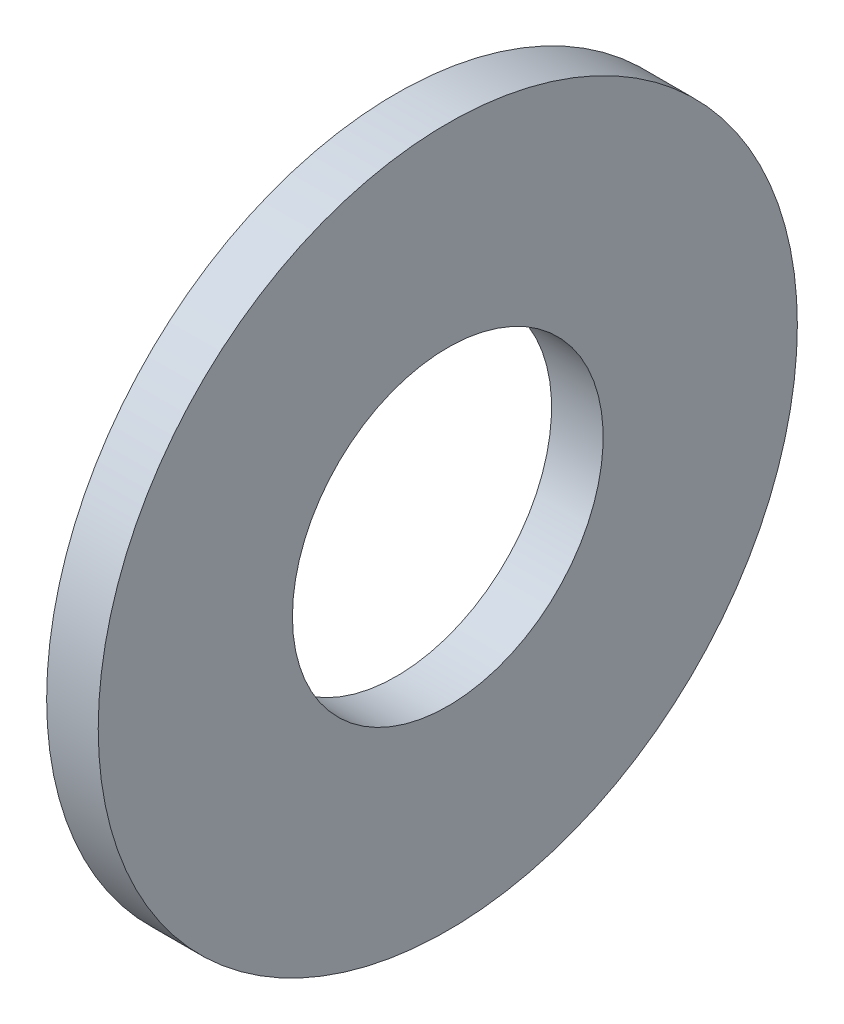
ISO-10303-21;
HEADER;
FILE_DESCRIPTION(('STEP AP214'),'2;1');
FILE_NAME('part.step','',(''),(''),'','','');
FILE_SCHEMA(('AUTOMOTIVE_DESIGN { 1 0 10303 214 1 1 1 1 }'));
ENDSEC;
DATA;
#1=APPLICATION_CONTEXT('core data for automotive mechanical design processes');
#2=APPLICATION_PROTOCOL_DEFINITION('international standard','automotive_design',2000,#1);
#3=PRODUCT_CONTEXT('',#1,'mechanical');
#4=PRODUCT('Part','Part','',(#3));
#5=PRODUCT_RELATED_PRODUCT_CATEGORY('part','',(#4));
#6=PRODUCT_DEFINITION_FORMATION('','',#4);
#7=PRODUCT_DEFINITION_CONTEXT('part definition',#1,'design');
#8=PRODUCT_DEFINITION('design','',#6,#7);
#9=PRODUCT_DEFINITION_SHAPE('','',#8);
#10=(LENGTH_UNIT() NAMED_UNIT(*) SI_UNIT(.MILLI.,.METRE.));
#11=(NAMED_UNIT(*) PLANE_ANGLE_UNIT() SI_UNIT($,.RADIAN.));
#12=(NAMED_UNIT(*) SI_UNIT($,.STERADIAN.) SOLID_ANGLE_UNIT());
#13=UNCERTAINTY_MEASURE_WITH_UNIT(LENGTH_MEASURE(1.E-05),#10,'distance_accuracy_value','');
#14=(GEOMETRIC_REPRESENTATION_CONTEXT(3) GLOBAL_UNCERTAINTY_ASSIGNED_CONTEXT((#13)) GLOBAL_UNIT_ASSIGNED_CONTEXT((#10,
#11,#12)) REPRESENTATION_CONTEXT('',''));
#15=CARTESIAN_POINT('',(0.,0.,0.));
#16=DIRECTION('',(0.,0.,1.));
#17=DIRECTION('',(1.,0.,0.));
#18=AXIS2_PLACEMENT_3D('',#15,#16,#17);
#19=CARTESIAN_POINT('',(-34.9249999999999,0.,0.));
#20=DIRECTION('',(-1.,0.,0.));
#21=DIRECTION('',(0.,0.,0.999999999999998));
#22=AXIS2_PLACEMENT_3D('',#19,#20,#21);
#23=CYLINDRICAL_SURFACE('',#22,6.35);
#24=CARTESIAN_POINT('',(0.,0.,0.));
#25=DIRECTION('',(-1.,0.,0.));
#26=DIRECTION('',(0.,0.,0.999999999999998));
#27=AXIS2_PLACEMENT_3D('',#24,#25,#26);
#28=CIRCLE('',#27,6.35);
#29=CARTESIAN_POINT('',(0.,0.,6.34999999999999));
#30=VERTEX_POINT('',#29);
#31=EDGE_CURVE('E10',#30,#30,#28,.T.);
#32=ORIENTED_EDGE('',*,*,#31,.F.);
#33=EDGE_LOOP('',(#32));
#34=FACE_BOUND('',#33,.T.);
#35=CARTESIAN_POINT('',(-2.10819999999999,0.,0.));
#36=DIRECTION('',(-1.,0.,0.));
#37=DIRECTION('',(0.,0.,0.999999999999998));
#38=AXIS2_PLACEMENT_3D('',#35,#36,#37);
#39=CIRCLE('',#38,6.35);
#40=CARTESIAN_POINT('',(-2.10819999999999,0.,6.34999999999999));
#41=VERTEX_POINT('',#40);
#42=EDGE_CURVE('E44',#41,#41,#39,.T.);
#43=ORIENTED_EDGE('',*,*,#42,.T.);
#44=EDGE_LOOP('',(#43));
#45=FACE_BOUND('',#44,.T.);
#46=ADVANCED_FACE('F30',(#34,#45),#23,.F.);
#47=CARTESIAN_POINT('',(0.,6.34999999999994,0.));
#48=DIRECTION('',(-1.,0.,0.));
#49=DIRECTION('',(0.,0.,0.999999999999998));
#50=AXIS2_PLACEMENT_3D('',#47,#48,#49);
#51=PLANE('',#50);
#52=CARTESIAN_POINT('',(0.,0.,0.));
#53=DIRECTION('',(-1.,0.,0.));
#54=DIRECTION('',(0.,0.,0.999999999999998));
#55=AXIS2_PLACEMENT_3D('',#52,#53,#54);
#56=CIRCLE('',#55,14.2875);
#57=CARTESIAN_POINT('',(0.,0.,14.2875));
#58=VERTEX_POINT('',#57);
#59=EDGE_CURVE('E36',#58,#58,#56,.T.);
#60=ORIENTED_EDGE('',*,*,#59,.F.);
#61=EDGE_LOOP('',(#60));
#62=FACE_BOUND('',#61,.T.);
#63=ORIENTED_EDGE('',*,*,#31,.T.);
#64=EDGE_LOOP('',(#63));
#65=FACE_BOUND('',#64,.T.);
#66=ADVANCED_FACE('F59',(#62,#65),#51,.F.);
#67=CARTESIAN_POINT('',(-34.9249999999999,0.,0.));
#68=DIRECTION('',(-1.,0.,0.));
#69=DIRECTION('',(0.,0.,0.999999999999998));
#70=AXIS2_PLACEMENT_3D('',#67,#68,#69);
#71=CYLINDRICAL_SURFACE('',#70,14.2875);
#72=CARTESIAN_POINT('',(-2.10819999999999,0.,0.));
#73=DIRECTION('',(-1.,0.,0.));
#74=DIRECTION('',(0.,0.,0.999999999999998));
#75=AXIS2_PLACEMENT_3D('',#72,#73,#74);
#76=CIRCLE('',#75,14.2875);
#77=CARTESIAN_POINT('',(-2.10819999999999,0.,14.2875));
#78=VERTEX_POINT('',#77);
#79=EDGE_CURVE('E40',#78,#78,#76,.T.);
#80=ORIENTED_EDGE('',*,*,#79,.F.);
#81=EDGE_LOOP('',(#80));
#82=FACE_BOUND('',#81,.T.);
#83=ORIENTED_EDGE('',*,*,#59,.T.);
#84=EDGE_LOOP('',(#83));
#85=FACE_BOUND('',#84,.T.);
#86=ADVANCED_FACE('F54',(#82,#85),#71,.T.);
#87=CARTESIAN_POINT('',(-2.10820000000006,14.2875,3.19189119579733E-13));
#88=DIRECTION('',(1.,0.,0.));
#89=DIRECTION('',(0.,0.,-0.999999999999998));
#90=AXIS2_PLACEMENT_3D('',#87,#88,#89);
#91=PLANE('',#90);
#92=ORIENTED_EDGE('',*,*,#42,.F.);
#93=EDGE_LOOP('',(#92));
#94=FACE_BOUND('',#93,.T.);
#95=ORIENTED_EDGE('',*,*,#79,.T.);
#96=EDGE_LOOP('',(#95));
#97=FACE_BOUND('',#96,.T.);
#98=ADVANCED_FACE('F51',(#94,#97),#91,.F.);
#99=CLOSED_SHELL('',(#46,#66,#86,#98));
#100=MANIFOLD_SOLID_BREP('B2',#99);
#101=ADVANCED_BREP_SHAPE_REPRESENTATION('',(#18,#100),#14);
#102=SHAPE_DEFINITION_REPRESENTATION(#9,#101);
ENDSEC;
END-ISO-10303-21;
